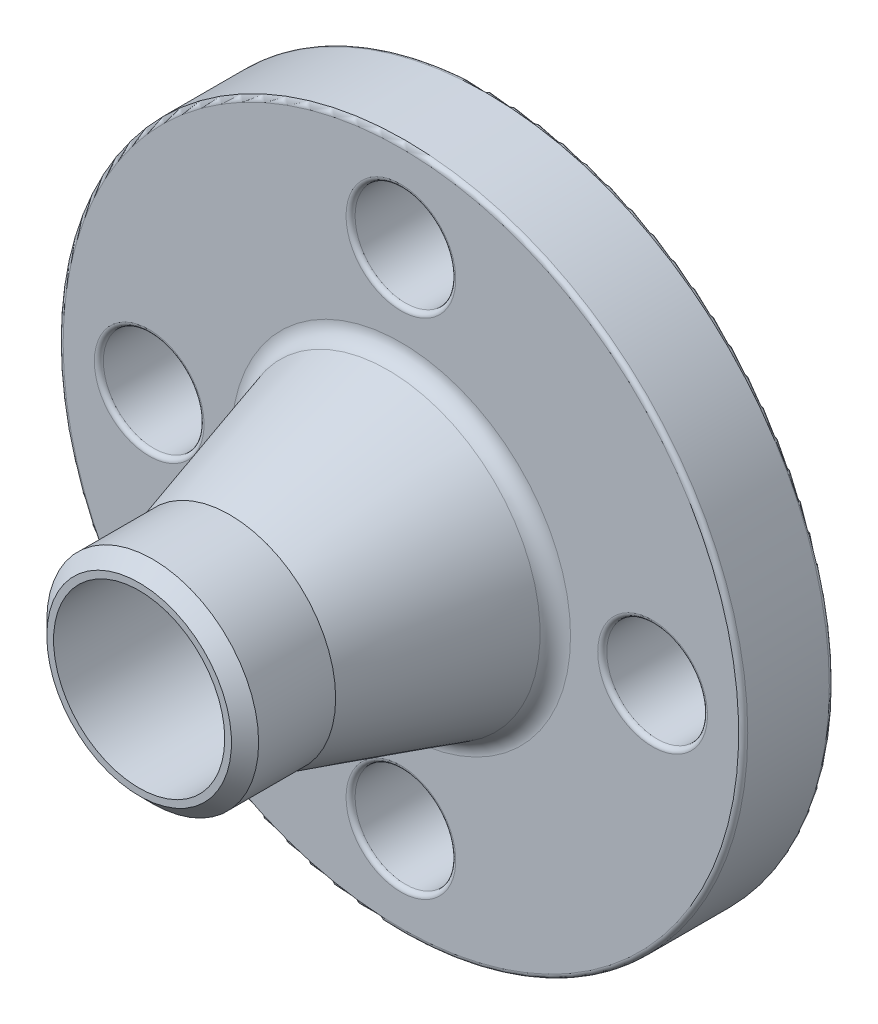
ISO-10303-21;
HEADER;
FILE_DESCRIPTION(('STEP AP214'),'2;1');
FILE_NAME('part.step','',(''),(''),'','','');
FILE_SCHEMA(('AUTOMOTIVE_DESIGN { 1 0 10303 214 1 1 1 1 }'));
ENDSEC;
DATA;
#1=APPLICATION_CONTEXT('core data for automotive mechanical design processes');
#2=APPLICATION_PROTOCOL_DEFINITION('international standard','automotive_design',2000,#1);
#3=PRODUCT_CONTEXT('',#1,'mechanical');
#4=PRODUCT('Part','Part','',(#3));
#5=PRODUCT_RELATED_PRODUCT_CATEGORY('part','',(#4));
#6=PRODUCT_DEFINITION_FORMATION('','',#4);
#7=PRODUCT_DEFINITION_CONTEXT('part definition',#1,'design');
#8=PRODUCT_DEFINITION('design','',#6,#7);
#9=PRODUCT_DEFINITION_SHAPE('','',#8);
#10=(LENGTH_UNIT() NAMED_UNIT(*) SI_UNIT(.MILLI.,.METRE.));
#11=(NAMED_UNIT(*) PLANE_ANGLE_UNIT() SI_UNIT($,.RADIAN.));
#12=(NAMED_UNIT(*) SI_UNIT($,.STERADIAN.) SOLID_ANGLE_UNIT());
#13=UNCERTAINTY_MEASURE_WITH_UNIT(LENGTH_MEASURE(1.E-05),#10,'distance_accuracy_value','');
#14=(GEOMETRIC_REPRESENTATION_CONTEXT(3) GLOBAL_UNCERTAINTY_ASSIGNED_CONTEXT((#13)) GLOBAL_UNIT_ASSIGNED_CONTEXT((#10,
#11,#12)) REPRESENTATION_CONTEXT('',''));
#15=CARTESIAN_POINT('',(0.,0.,0.));
#16=DIRECTION('',(0.,0.,1.));
#17=DIRECTION('',(1.,0.,0.));
#18=AXIS2_PLACEMENT_3D('',#15,#16,#17);
#19=CARTESIAN_POINT('',(0.,0.,27.78125));
#20=DIRECTION('',(0.,0.,1.));
#21=DIRECTION('',(1.,0.,0.));
#22=AXIS2_PLACEMENT_3D('',#19,#20,#21);
#23=CYLINDRICAL_SURFACE('',#22,16.7005);
#24=CARTESIAN_POINT('',(0.,0.,25.638125));
#25=DIRECTION('',(0.,0.,-1.));
#26=DIRECTION('',(-1.,0.,0.));
#27=AXIS2_PLACEMENT_3D('',#24,#25,#26);
#28=CIRCLE('',#27,16.7005);
#29=CARTESIAN_POINT('',(-16.7005,0.,25.638125));
#30=VERTEX_POINT('',#29);
#31=EDGE_CURVE('E109',#30,#30,#28,.T.);
#32=ORIENTED_EDGE('',*,*,#31,.T.);
#33=EDGE_LOOP('',(#32));
#34=FACE_BOUND('',#33,.T.);
#35=CARTESIAN_POINT('',(0.,0.,13.49375));
#36=DIRECTION('',(0.,0.,1.));
#37=DIRECTION('',(1.,0.,0.));
#38=AXIS2_PLACEMENT_3D('',#35,#36,#37);
#39=CIRCLE('',#38,16.7005);
#40=CARTESIAN_POINT('',(16.7005,0.,13.49375));
#41=VERTEX_POINT('',#40);
#42=EDGE_CURVE('E124',#41,#41,#39,.T.);
#43=ORIENTED_EDGE('',*,*,#42,.T.);
#44=EDGE_LOOP('',(#43));
#45=FACE_BOUND('',#44,.T.);
#46=ADVANCED_FACE('F35',(#34,#45),#23,.T.);
#47=CARTESIAN_POINT('',(0.,16.7005,27.78125));
#48=DIRECTION('',(0.,0.,-1.));
#49=DIRECTION('',(-1.,0.,0.));
#50=AXIS2_PLACEMENT_3D('',#47,#48,#49);
#51=PLANE('',#50);
#52=CARTESIAN_POINT('',(0.,0.,27.78125));
#53=DIRECTION('',(0.,0.,-1.));
#54=DIRECTION('',(-1.,0.,0.));
#55=AXIS2_PLACEMENT_3D('',#52,#53,#54);
#56=CIRCLE('',#55,14.557375);
#57=CARTESIAN_POINT('',(-14.557375,0.,27.78125));
#58=VERTEX_POINT('',#57);
#59=EDGE_CURVE('E112',#58,#58,#56,.F.);
#60=ORIENTED_EDGE('',*,*,#59,.T.);
#61=EDGE_LOOP('',(#60));
#62=FACE_BOUND('',#61,.T.);
#63=CARTESIAN_POINT('',(0.,0.,27.78125));
#64=DIRECTION('',(0.,0.,1.));
#65=DIRECTION('',(1.,0.,0.));
#66=AXIS2_PLACEMENT_3D('',#63,#64,#65);
#67=CIRCLE('',#66,13.49375);
#68=CARTESIAN_POINT('',(13.49375,0.,27.78125));
#69=VERTEX_POINT('',#68);
#70=EDGE_CURVE('E121',#69,#69,#67,.T.);
#71=ORIENTED_EDGE('',*,*,#70,.F.);
#72=EDGE_LOOP('',(#71));
#73=FACE_BOUND('',#72,.T.);
#74=ADVANCED_FACE('F146',(#62,#73),#51,.F.);
#75=CARTESIAN_POINT('',(0.,0.,27.78125));
#76=DIRECTION('',(0.,0.,1.));
#77=DIRECTION('',(1.,0.,0.));
#78=AXIS2_PLACEMENT_3D('',#75,#76,#77);
#79=CYLINDRICAL_SURFACE('',#78,13.49375);
#80=CARTESIAN_POINT('',(0.,0.,-27.066875));
#81=DIRECTION('',(0.,0.,1.));
#82=DIRECTION('',(1.,0.,0.));
#83=AXIS2_PLACEMENT_3D('',#80,#81,#82);
#84=CIRCLE('',#83,13.49375);
#85=CARTESIAN_POINT('',(13.49375,0.,-27.066875));
#86=VERTEX_POINT('',#85);
#87=EDGE_CURVE('E88',#86,#86,#84,.F.);
#88=ORIENTED_EDGE('',*,*,#87,.T.);
#89=EDGE_LOOP('',(#88));
#90=FACE_BOUND('',#89,.T.);
#91=ORIENTED_EDGE('',*,*,#70,.T.);
#92=EDGE_LOOP('',(#91));
#93=FACE_BOUND('',#92,.T.);
#94=ADVANCED_FACE('F152',(#90,#93),#79,.F.);
#95=CARTESIAN_POINT('',(0.,13.49375,-27.78125));
#96=DIRECTION('',(0.,0.,1.));
#97=DIRECTION('',(1.,0.,0.));
#98=AXIS2_PLACEMENT_3D('',#95,#96,#97);
#99=PLANE('',#98);
#100=CARTESIAN_POINT('',(0.,0.,-27.78125));
#101=DIRECTION('',(0.,0.,1.));
#102=DIRECTION('',(1.,0.,0.));
#103=AXIS2_PLACEMENT_3D('',#100,#101,#102);
#104=CIRCLE('',#103,14.208125);
#105=CARTESIAN_POINT('',(14.208125,0.,-27.78125));
#106=VERTEX_POINT('',#105);
#107=EDGE_CURVE('E91',#106,#106,#104,.T.);
#108=ORIENTED_EDGE('',*,*,#107,.T.);
#109=EDGE_LOOP('',(#108));
#110=FACE_BOUND('',#109,.T.);
#111=CARTESIAN_POINT('',(0.,0.,-27.78125));
#112=DIRECTION('',(0.,0.,1.));
#113=DIRECTION('',(1.,0.,0.));
#114=AXIS2_PLACEMENT_3D('',#111,#112,#113);
#115=CIRCLE('',#114,53.260625);
#116=CARTESIAN_POINT('',(53.260625,0.,-27.78125));
#117=VERTEX_POINT('',#116);
#118=EDGE_CURVE('E94',#117,#117,#115,.F.);
#119=ORIENTED_EDGE('',*,*,#118,.T.);
#120=EDGE_LOOP('',(#119));
#121=FACE_BOUND('',#120,.T.);
#122=CARTESIAN_POINT('',(0.,39.6875,-27.78125));
#123=DIRECTION('',(0.,0.,1.));
#124=DIRECTION('',(1.,0.,0.));
#125=AXIS2_PLACEMENT_3D('',#122,#123,#124);
#126=CIRCLE('',#125,8.651875);
#127=CARTESIAN_POINT('',(8.651875,39.6875,-27.78125));
#128=VERTEX_POINT('',#127);
#129=EDGE_CURVE('E97',#128,#128,#126,.T.);
#130=ORIENTED_EDGE('',*,*,#129,.T.);
#131=EDGE_LOOP('',(#130));
#132=FACE_BOUND('',#131,.T.);
#133=CARTESIAN_POINT('',(-39.6875,4.15704496906011E-13,-27.78125));
#134=DIRECTION('',(0.,0.,1.));
#135=DIRECTION('',(1.,0.,0.));
#136=AXIS2_PLACEMENT_3D('',#133,#134,#135);
#137=CIRCLE('',#136,8.651875);
#138=CARTESIAN_POINT('',(-31.035625,4.15704496906011E-13,-27.78125));
#139=VERTEX_POINT('',#138);
#140=EDGE_CURVE('E100',#139,#139,#137,.T.);
#141=ORIENTED_EDGE('',*,*,#140,.T.);
#142=EDGE_LOOP('',(#141));
#143=FACE_BOUND('',#142,.T.);
#144=CARTESIAN_POINT('',(0.,-39.6875,-27.78125));
#145=DIRECTION('',(0.,0.,1.));
#146=DIRECTION('',(1.,0.,0.));
#147=AXIS2_PLACEMENT_3D('',#144,#145,#146);
#148=CIRCLE('',#147,8.651875);
#149=CARTESIAN_POINT('',(8.651875,-39.6875,-27.78125));
#150=VERTEX_POINT('',#149);
#151=EDGE_CURVE('E103',#150,#150,#148,.T.);
#152=ORIENTED_EDGE('',*,*,#151,.T.);
#153=EDGE_LOOP('',(#152));
#154=FACE_BOUND('',#153,.T.);
#155=CARTESIAN_POINT('',(39.6875,-1.38568165635337E-13,-27.78125));
#156=DIRECTION('',(0.,0.,1.));
#157=DIRECTION('',(1.,0.,0.));
#158=AXIS2_PLACEMENT_3D('',#155,#156,#157);
#159=CIRCLE('',#158,8.651875);
#160=CARTESIAN_POINT('',(48.339375,-1.38568165635337E-13,-27.78125));
#161=VERTEX_POINT('',#160);
#162=EDGE_CURVE('E106',#161,#161,#159,.T.);
#163=ORIENTED_EDGE('',*,*,#162,.T.);
#164=EDGE_LOOP('',(#163));
#165=FACE_BOUND('',#164,.T.);
#166=ADVANCED_FACE('F227',(#110,#121,#132,#143,#154,#165),#99,.F.);
#167=CARTESIAN_POINT('',(0.,0.,27.78125));
#168=DIRECTION('',(0.,0.,1.));
#169=DIRECTION('',(1.,0.,0.));
#170=AXIS2_PLACEMENT_3D('',#167,#168,#169);
#171=CYLINDRICAL_SURFACE('',#170,53.975);
#172=CARTESIAN_POINT('',(0.,0.,-27.066875));
#173=DIRECTION('',(0.,0.,1.));
#174=DIRECTION('',(1.,0.,0.));
#175=AXIS2_PLACEMENT_3D('',#172,#173,#174);
#176=CIRCLE('',#175,53.975);
#177=CARTESIAN_POINT('',(53.975,0.,-27.066875));
#178=VERTEX_POINT('',#177);
#179=EDGE_CURVE('E82',#178,#178,#176,.T.);
#180=ORIENTED_EDGE('',*,*,#179,.T.);
#181=EDGE_LOOP('',(#180));
#182=FACE_BOUND('',#181,.T.);
#183=CARTESIAN_POINT('',(0.,0.,-14.208125));
#184=DIRECTION('',(0.,0.,-1.));
#185=DIRECTION('',(-1.,0.,0.));
#186=AXIS2_PLACEMENT_3D('',#183,#184,#185);
#187=CIRCLE('',#186,53.975);
#188=CARTESIAN_POINT('',(-53.975,0.,-14.208125));
#189=VERTEX_POINT('',#188);
#190=EDGE_CURVE('E85',#189,#189,#187,.T.);
#191=ORIENTED_EDGE('',*,*,#190,.T.);
#192=EDGE_LOOP('',(#191));
#193=FACE_BOUND('',#192,.T.);
#194=ADVANCED_FACE('F143',(#182,#193),#171,.T.);
#195=CARTESIAN_POINT('',(0.,53.975,-13.49375));
#196=DIRECTION('',(0.,0.,-1.));
#197=DIRECTION('',(-1.,0.,0.));
#198=AXIS2_PLACEMENT_3D('',#195,#196,#197);
#199=PLANE('',#198);
#200=CARTESIAN_POINT('',(0.,0.,-13.49375));
#201=DIRECTION('',(0.,0.,-1.));
#202=DIRECTION('',(-1.,0.,0.));
#203=AXIS2_PLACEMENT_3D('',#200,#201,#202);
#204=CIRCLE('',#203,53.260625);
#205=CARTESIAN_POINT('',(-53.260625,0.,-13.49375));
#206=VERTEX_POINT('',#205);
#207=EDGE_CURVE('E10',#206,#206,#204,.F.);
#208=ORIENTED_EDGE('',*,*,#207,.T.);
#209=EDGE_LOOP('',(#208));
#210=FACE_BOUND('',#209,.T.);
#211=CARTESIAN_POINT('',(0.,39.6875,-13.49375));
#212=DIRECTION('',(0.,0.,-1.));
#213=DIRECTION('',(-1.,0.,0.));
#214=AXIS2_PLACEMENT_3D('',#211,#212,#213);
#215=CIRCLE('',#214,8.651875);
#216=CARTESIAN_POINT('',(-8.651875,39.6875,-13.49375));
#217=VERTEX_POINT('',#216);
#218=EDGE_CURVE('E42',#217,#217,#215,.T.);
#219=ORIENTED_EDGE('',*,*,#218,.T.);
#220=EDGE_LOOP('',(#219));
#221=FACE_BOUND('',#220,.T.);
#222=CARTESIAN_POINT('',(-39.6875,4.15704496906011E-13,-13.49375));
#223=DIRECTION('',(0.,0.,-1.));
#224=DIRECTION('',(-1.,0.,0.));
#225=AXIS2_PLACEMENT_3D('',#222,#223,#224);
#226=CIRCLE('',#225,8.651875);
#227=CARTESIAN_POINT('',(-48.339375,4.15704496906011E-13,-13.49375));
#228=VERTEX_POINT('',#227);
#229=EDGE_CURVE('E46',#228,#228,#226,.T.);
#230=ORIENTED_EDGE('',*,*,#229,.T.);
#231=EDGE_LOOP('',(#230));
#232=FACE_BOUND('',#231,.T.);
#233=CARTESIAN_POINT('',(0.,-39.6875,-13.49375));
#234=DIRECTION('',(0.,0.,-1.));
#235=DIRECTION('',(-1.,0.,0.));
#236=AXIS2_PLACEMENT_3D('',#233,#234,#235);
#237=CIRCLE('',#236,8.651875);
#238=CARTESIAN_POINT('',(-8.651875,-39.6875,-13.49375));
#239=VERTEX_POINT('',#238);
#240=EDGE_CURVE('E50',#239,#239,#237,.T.);
#241=ORIENTED_EDGE('',*,*,#240,.T.);
#242=EDGE_LOOP('',(#241));
#243=FACE_BOUND('',#242,.T.);
#244=CARTESIAN_POINT('',(39.6875,-1.38568165635337E-13,-13.49375));
#245=DIRECTION('',(0.,0.,-1.));
#246=DIRECTION('',(-1.,0.,0.));
#247=AXIS2_PLACEMENT_3D('',#244,#245,#246);
#248=CIRCLE('',#247,8.651875);
#249=CARTESIAN_POINT('',(31.035625,-1.38568165635337E-13,-13.49375));
#250=VERTEX_POINT('',#249);
#251=EDGE_CURVE('E55',#250,#250,#248,.T.);
#252=ORIENTED_EDGE('',*,*,#251,.T.);
#253=EDGE_LOOP('',(#252));
#254=FACE_BOUND('',#253,.T.);
#255=CARTESIAN_POINT('',(0.,0.,-13.49375));
#256=DIRECTION('',(0.,0.,-1.));
#257=DIRECTION('',(-1.,0.,0.));
#258=AXIS2_PLACEMENT_3D('',#255,#256,#257);
#259=CIRCLE('',#258,26.7467548761439);
#260=CARTESIAN_POINT('',(-26.7467548761439,0.,-13.49375));
#261=VERTEX_POINT('',#260);
#262=EDGE_CURVE('E115',#261,#261,#259,.T.);
#263=ORIENTED_EDGE('',*,*,#262,.T.);
#264=EDGE_LOOP('',(#263));
#265=FACE_BOUND('',#264,.T.);
#266=ADVANCED_FACE('F132',(#210,#221,#232,#243,#254,#265),#199,.F.);
#267=CARTESIAN_POINT('',(0.,0.,-13.49375));
#268=DIRECTION('',(0.,0.,-1.));
#269=DIRECTION('',(-1.,0.,0.));
#270=AXIS2_PLACEMENT_3D('',#267,#268,#269);
#271=CONICAL_SURFACE('',#270,24.60625,0.2849682946417);
#272=CARTESIAN_POINT('',(0.,0.,-11.4395704731872));
#273=DIRECTION('',(0.,0.,-1.));
#274=DIRECTION('',(-1.,0.,0.));
#275=AXIS2_PLACEMENT_3D('',#272,#273,#274);
#276=CIRCLE('',#275,24.0044962327337);
#277=CARTESIAN_POINT('',(-24.0044962327337,0.,-11.4395704731872));
#278=VERTEX_POINT('',#277);
#279=EDGE_CURVE('E118',#278,#278,#276,.F.);
#280=ORIENTED_EDGE('',*,*,#279,.T.);
#281=EDGE_LOOP('',(#280));
#282=FACE_BOUND('',#281,.T.);
#283=ORIENTED_EDGE('',*,*,#42,.F.);
#284=EDGE_LOOP('',(#283));
#285=FACE_BOUND('',#284,.T.);
#286=ADVANCED_FACE('F129',(#282,#285),#271,.T.);
#287=CARTESIAN_POINT('',(0.,39.6875,-27.78125));
#288=DIRECTION('',(0.,0.,1.));
#289=DIRECTION('',(1.,0.,0.));
#290=AXIS2_PLACEMENT_3D('',#287,#288,#289);
#291=CYLINDRICAL_SURFACE('',#290,7.9375);
#292=CARTESIAN_POINT('',(0.,39.6875,-27.066875));
#293=DIRECTION('',(0.,0.,1.));
#294=DIRECTION('',(1.,0.,0.));
#295=AXIS2_PLACEMENT_3D('',#292,#293,#294);
#296=CIRCLE('',#295,7.9375);
#297=CARTESIAN_POINT('',(7.9375,39.6875,-27.066875));
#298=VERTEX_POINT('',#297);
#299=EDGE_CURVE('E76',#298,#298,#296,.F.);
#300=ORIENTED_EDGE('',*,*,#299,.T.);
#301=EDGE_LOOP('',(#300));
#302=FACE_BOUND('',#301,.T.);
#303=CARTESIAN_POINT('',(0.,39.6875,-14.208125));
#304=DIRECTION('',(0.,0.,-1.));
#305=DIRECTION('',(-1.,0.,0.));
#306=AXIS2_PLACEMENT_3D('',#303,#304,#305);
#307=CIRCLE('',#306,7.9375);
#308=CARTESIAN_POINT('',(-7.9375,39.6875,-14.208125));
#309=VERTEX_POINT('',#308);
#310=EDGE_CURVE('E79',#309,#309,#307,.F.);
#311=ORIENTED_EDGE('',*,*,#310,.T.);
#312=EDGE_LOOP('',(#311));
#313=FACE_BOUND('',#312,.T.);
#314=ADVANCED_FACE('F131',(#302,#313),#291,.F.);
#315=CARTESIAN_POINT('',(-39.6875,4.15704496906011E-13,-27.78125));
#316=DIRECTION('',(0.,0.,1.));
#317=DIRECTION('',(1.,0.,0.));
#318=AXIS2_PLACEMENT_3D('',#315,#316,#317);
#319=CYLINDRICAL_SURFACE('',#318,7.9375);
#320=CARTESIAN_POINT('',(-39.6875,4.15704496906011E-13,-27.066875));
#321=DIRECTION('',(0.,0.,1.));
#322=DIRECTION('',(1.,0.,0.));
#323=AXIS2_PLACEMENT_3D('',#320,#321,#322);
#324=CIRCLE('',#323,7.9375);
#325=CARTESIAN_POINT('',(-31.75,4.15704496906011E-13,-27.066875));
#326=VERTEX_POINT('',#325);
#327=EDGE_CURVE('E70',#326,#326,#324,.F.);
#328=ORIENTED_EDGE('',*,*,#327,.T.);
#329=EDGE_LOOP('',(#328));
#330=FACE_BOUND('',#329,.T.);
#331=CARTESIAN_POINT('',(-39.6875,4.15704496906011E-13,-14.208125));
#332=DIRECTION('',(0.,0.,-1.));
#333=DIRECTION('',(-1.,0.,0.));
#334=AXIS2_PLACEMENT_3D('',#331,#332,#333);
#335=CIRCLE('',#334,7.9375);
#336=CARTESIAN_POINT('',(-47.625,4.15704496906011E-13,-14.208125));
#337=VERTEX_POINT('',#336);
#338=EDGE_CURVE('E73',#337,#337,#335,.F.);
#339=ORIENTED_EDGE('',*,*,#338,.T.);
#340=EDGE_LOOP('',(#339));
#341=FACE_BOUND('',#340,.T.);
#342=ADVANCED_FACE('F139',(#330,#341),#319,.F.);
#343=CARTESIAN_POINT('',(0.,-39.6875,-27.78125));
#344=DIRECTION('',(0.,0.,1.));
#345=DIRECTION('',(1.,0.,0.));
#346=AXIS2_PLACEMENT_3D('',#343,#344,#345);
#347=CYLINDRICAL_SURFACE('',#346,7.9375);
#348=CARTESIAN_POINT('',(0.,-39.6875,-27.066875));
#349=DIRECTION('',(0.,0.,1.));
#350=DIRECTION('',(1.,0.,0.));
#351=AXIS2_PLACEMENT_3D('',#348,#349,#350);
#352=CIRCLE('',#351,7.9375);
#353=CARTESIAN_POINT('',(7.9375,-39.6875,-27.066875));
#354=VERTEX_POINT('',#353);
#355=EDGE_CURVE('E64',#354,#354,#352,.F.);
#356=ORIENTED_EDGE('',*,*,#355,.T.);
#357=EDGE_LOOP('',(#356));
#358=FACE_BOUND('',#357,.T.);
#359=CARTESIAN_POINT('',(0.,-39.6875,-14.208125));
#360=DIRECTION('',(0.,0.,-1.));
#361=DIRECTION('',(-1.,0.,0.));
#362=AXIS2_PLACEMENT_3D('',#359,#360,#361);
#363=CIRCLE('',#362,7.9375);
#364=CARTESIAN_POINT('',(-7.9375,-39.6875,-14.208125));
#365=VERTEX_POINT('',#364);
#366=EDGE_CURVE('E67',#365,#365,#363,.F.);
#367=ORIENTED_EDGE('',*,*,#366,.T.);
#368=EDGE_LOOP('',(#367));
#369=FACE_BOUND('',#368,.T.);
#370=ADVANCED_FACE('F211',(#358,#369),#347,.F.);
#371=CARTESIAN_POINT('',(39.6875,-1.38568165635337E-13,-27.78125));
#372=DIRECTION('',(0.,0.,1.));
#373=DIRECTION('',(1.,0.,0.));
#374=AXIS2_PLACEMENT_3D('',#371,#372,#373);
#375=CYLINDRICAL_SURFACE('',#374,7.9375);
#376=CARTESIAN_POINT('',(39.6875,-1.38568165635337E-13,-27.066875));
#377=DIRECTION('',(0.,0.,1.));
#378=DIRECTION('',(1.,0.,0.));
#379=AXIS2_PLACEMENT_3D('',#376,#377,#378);
#380=CIRCLE('',#379,7.9375);
#381=CARTESIAN_POINT('',(47.625,-1.38568165635337E-13,-27.066875));
#382=VERTEX_POINT('',#381);
#383=EDGE_CURVE('E58',#382,#382,#380,.F.);
#384=ORIENTED_EDGE('',*,*,#383,.T.);
#385=EDGE_LOOP('',(#384));
#386=FACE_BOUND('',#385,.T.);
#387=CARTESIAN_POINT('',(39.6875,-1.38568165635337E-13,-14.208125));
#388=DIRECTION('',(0.,0.,-1.));
#389=DIRECTION('',(-1.,0.,0.));
#390=AXIS2_PLACEMENT_3D('',#387,#388,#389);
#391=CIRCLE('',#390,7.9375);
#392=CARTESIAN_POINT('',(31.75,-1.38568165635337E-13,-14.208125));
#393=VERTEX_POINT('',#392);
#394=EDGE_CURVE('E61',#393,#393,#391,.F.);
#395=ORIENTED_EDGE('',*,*,#394,.T.);
#396=EDGE_LOOP('',(#395));
#397=FACE_BOUND('',#396,.T.);
#398=ADVANCED_FACE('F160',(#386,#397),#375,.F.);
#399=CARTESIAN_POINT('',(0.,0.,-10.63625));
#400=DIRECTION('',(0.,0.,-1.));
#401=DIRECTION('',(-1.,0.,0.));
#402=AXIS2_PLACEMENT_3D('',#399,#400,#401);
#403=TOROIDAL_SURFACE('',#402,26.7467548761439,2.8575);
#404=ORIENTED_EDGE('',*,*,#262,.F.);
#405=EDGE_LOOP('',(#404));
#406=FACE_BOUND('',#405,.T.);
#407=ORIENTED_EDGE('',*,*,#279,.F.);
#408=EDGE_LOOP('',(#407));
#409=FACE_BOUND('',#408,.T.);
#410=ADVANCED_FACE('F157',(#406,#409),#403,.F.);
#411=CARTESIAN_POINT('',(0.,0.,27.78125));
#412=DIRECTION('',(0.,0.,-1.));
#413=DIRECTION('',(-1.,0.,0.));
#414=AXIS2_PLACEMENT_3D('',#411,#412,#413);
#415=CONICAL_SURFACE('',#414,14.557375,0.785398163397449);
#416=ORIENTED_EDGE('',*,*,#31,.F.);
#417=EDGE_LOOP('',(#416));
#418=FACE_BOUND('',#417,.T.);
#419=ORIENTED_EDGE('',*,*,#59,.F.);
#420=EDGE_LOOP('',(#419));
#421=FACE_BOUND('',#420,.T.);
#422=ADVANCED_FACE('F159',(#418,#421),#415,.T.);
#423=CARTESIAN_POINT('',(0.,0.,-27.066875));
#424=DIRECTION('',(0.,0.,1.));
#425=DIRECTION('',(1.,0.,0.));
#426=AXIS2_PLACEMENT_3D('',#423,#424,#425);
#427=TOROIDAL_SURFACE('',#426,14.208125,0.714375);
#428=ORIENTED_EDGE('',*,*,#87,.F.);
#429=EDGE_LOOP('',(#428));
#430=FACE_BOUND('',#429,.T.);
#431=ORIENTED_EDGE('',*,*,#107,.F.);
#432=EDGE_LOOP('',(#431));
#433=FACE_BOUND('',#432,.T.);
#434=ADVANCED_FACE('F164',(#430,#433),#427,.T.);
#435=CARTESIAN_POINT('',(0.,0.,-27.066875));
#436=DIRECTION('',(0.,0.,1.));
#437=DIRECTION('',(1.,0.,0.));
#438=AXIS2_PLACEMENT_3D('',#435,#436,#437);
#439=TOROIDAL_SURFACE('',#438,53.260625,0.714375);
#440=ORIENTED_EDGE('',*,*,#118,.F.);
#441=EDGE_LOOP('',(#440));
#442=FACE_BOUND('',#441,.T.);
#443=ORIENTED_EDGE('',*,*,#179,.F.);
#444=EDGE_LOOP('',(#443));
#445=FACE_BOUND('',#444,.T.);
#446=ADVANCED_FACE('F168',(#442,#445),#439,.T.);
#447=CARTESIAN_POINT('',(0.,39.6875,-27.066875));
#448=DIRECTION('',(0.,0.,1.));
#449=DIRECTION('',(1.,0.,0.));
#450=AXIS2_PLACEMENT_3D('',#447,#448,#449);
#451=TOROIDAL_SURFACE('',#450,8.651875,0.714375);
#452=ORIENTED_EDGE('',*,*,#299,.F.);
#453=EDGE_LOOP('',(#452));
#454=FACE_BOUND('',#453,.T.);
#455=ORIENTED_EDGE('',*,*,#129,.F.);
#456=EDGE_LOOP('',(#455));
#457=FACE_BOUND('',#456,.T.);
#458=ADVANCED_FACE('F172',(#454,#457),#451,.T.);
#459=CARTESIAN_POINT('',(-39.6875,4.15704496906011E-13,-27.066875));
#460=DIRECTION('',(0.,0.,1.));
#461=DIRECTION('',(1.,0.,0.));
#462=AXIS2_PLACEMENT_3D('',#459,#460,#461);
#463=TOROIDAL_SURFACE('',#462,8.651875,0.714375);
#464=ORIENTED_EDGE('',*,*,#327,.F.);
#465=EDGE_LOOP('',(#464));
#466=FACE_BOUND('',#465,.T.);
#467=ORIENTED_EDGE('',*,*,#140,.F.);
#468=EDGE_LOOP('',(#467));
#469=FACE_BOUND('',#468,.T.);
#470=ADVANCED_FACE('F176',(#466,#469),#463,.T.);
#471=CARTESIAN_POINT('',(0.,-39.6875,-27.066875));
#472=DIRECTION('',(0.,0.,1.));
#473=DIRECTION('',(1.,0.,0.));
#474=AXIS2_PLACEMENT_3D('',#471,#472,#473);
#475=TOROIDAL_SURFACE('',#474,8.651875,0.714375);
#476=ORIENTED_EDGE('',*,*,#355,.F.);
#477=EDGE_LOOP('',(#476));
#478=FACE_BOUND('',#477,.T.);
#479=ORIENTED_EDGE('',*,*,#151,.F.);
#480=EDGE_LOOP('',(#479));
#481=FACE_BOUND('',#480,.T.);
#482=ADVANCED_FACE('F180',(#478,#481),#475,.T.);
#483=CARTESIAN_POINT('',(39.6875,-1.38568165635337E-13,-27.066875));
#484=DIRECTION('',(0.,0.,1.));
#485=DIRECTION('',(1.,0.,0.));
#486=AXIS2_PLACEMENT_3D('',#483,#484,#485);
#487=TOROIDAL_SURFACE('',#486,8.651875,0.714375);
#488=ORIENTED_EDGE('',*,*,#383,.F.);
#489=EDGE_LOOP('',(#488));
#490=FACE_BOUND('',#489,.T.);
#491=ORIENTED_EDGE('',*,*,#162,.F.);
#492=EDGE_LOOP('',(#491));
#493=FACE_BOUND('',#492,.T.);
#494=ADVANCED_FACE('F184',(#490,#493),#487,.T.);
#495=CARTESIAN_POINT('',(0.,0.,-14.208125));
#496=DIRECTION('',(0.,0.,-1.));
#497=DIRECTION('',(-1.,0.,0.));
#498=AXIS2_PLACEMENT_3D('',#495,#496,#497);
#499=TOROIDAL_SURFACE('',#498,53.260625,0.714375);
#500=ORIENTED_EDGE('',*,*,#190,.F.);
#501=EDGE_LOOP('',(#500));
#502=FACE_BOUND('',#501,.T.);
#503=ORIENTED_EDGE('',*,*,#207,.F.);
#504=EDGE_LOOP('',(#503));
#505=FACE_BOUND('',#504,.T.);
#506=ADVANCED_FACE('F188',(#502,#505),#499,.T.);
#507=CARTESIAN_POINT('',(0.,39.6875,-14.208125));
#508=DIRECTION('',(0.,0.,-1.));
#509=DIRECTION('',(-1.,0.,0.));
#510=AXIS2_PLACEMENT_3D('',#507,#508,#509);
#511=TOROIDAL_SURFACE('',#510,8.651875,0.714375);
#512=ORIENTED_EDGE('',*,*,#218,.F.);
#513=EDGE_LOOP('',(#512));
#514=FACE_BOUND('',#513,.T.);
#515=ORIENTED_EDGE('',*,*,#310,.F.);
#516=EDGE_LOOP('',(#515));
#517=FACE_BOUND('',#516,.T.);
#518=ADVANCED_FACE('F192',(#514,#517),#511,.T.);
#519=CARTESIAN_POINT('',(-39.6875,4.15704496906011E-13,-14.208125));
#520=DIRECTION('',(0.,0.,-1.));
#521=DIRECTION('',(-1.,0.,0.));
#522=AXIS2_PLACEMENT_3D('',#519,#520,#521);
#523=TOROIDAL_SURFACE('',#522,8.651875,0.714375);
#524=ORIENTED_EDGE('',*,*,#229,.F.);
#525=EDGE_LOOP('',(#524));
#526=FACE_BOUND('',#525,.T.);
#527=ORIENTED_EDGE('',*,*,#338,.F.);
#528=EDGE_LOOP('',(#527));
#529=FACE_BOUND('',#528,.T.);
#530=ADVANCED_FACE('F196',(#526,#529),#523,.T.);
#531=CARTESIAN_POINT('',(0.,-39.6875,-14.208125));
#532=DIRECTION('',(0.,0.,-1.));
#533=DIRECTION('',(-1.,0.,0.));
#534=AXIS2_PLACEMENT_3D('',#531,#532,#533);
#535=TOROIDAL_SURFACE('',#534,8.651875,0.714375);
#536=ORIENTED_EDGE('',*,*,#240,.F.);
#537=EDGE_LOOP('',(#536));
#538=FACE_BOUND('',#537,.T.);
#539=ORIENTED_EDGE('',*,*,#366,.F.);
#540=EDGE_LOOP('',(#539));
#541=FACE_BOUND('',#540,.T.);
#542=ADVANCED_FACE('F199',(#538,#541),#535,.T.);
#543=CARTESIAN_POINT('',(39.6875,-1.38568165635337E-13,-14.208125));
#544=DIRECTION('',(0.,0.,-1.));
#545=DIRECTION('',(-1.,0.,0.));
#546=AXIS2_PLACEMENT_3D('',#543,#544,#545);
#547=TOROIDAL_SURFACE('',#546,8.651875,0.714375);
#548=ORIENTED_EDGE('',*,*,#251,.F.);
#549=EDGE_LOOP('',(#548));
#550=FACE_BOUND('',#549,.T.);
#551=ORIENTED_EDGE('',*,*,#394,.F.);
#552=EDGE_LOOP('',(#551));
#553=FACE_BOUND('',#552,.T.);
#554=ADVANCED_FACE('F37',(#550,#553),#547,.T.);
#555=CLOSED_SHELL('',(#46,#74,#94,#166,#194,#266,#286,#314,#342,#370,#398,#410,#422,#434,#446,
#458,#470,#482,#494,#506,#518,#530,#542,#554));
#556=MANIFOLD_SOLID_BREP('B2',#555);
#557=ADVANCED_BREP_SHAPE_REPRESENTATION('',(#18,#556),#14);
#558=SHAPE_DEFINITION_REPRESENTATION(#9,#557);
ENDSEC;
END-ISO-10303-21;
